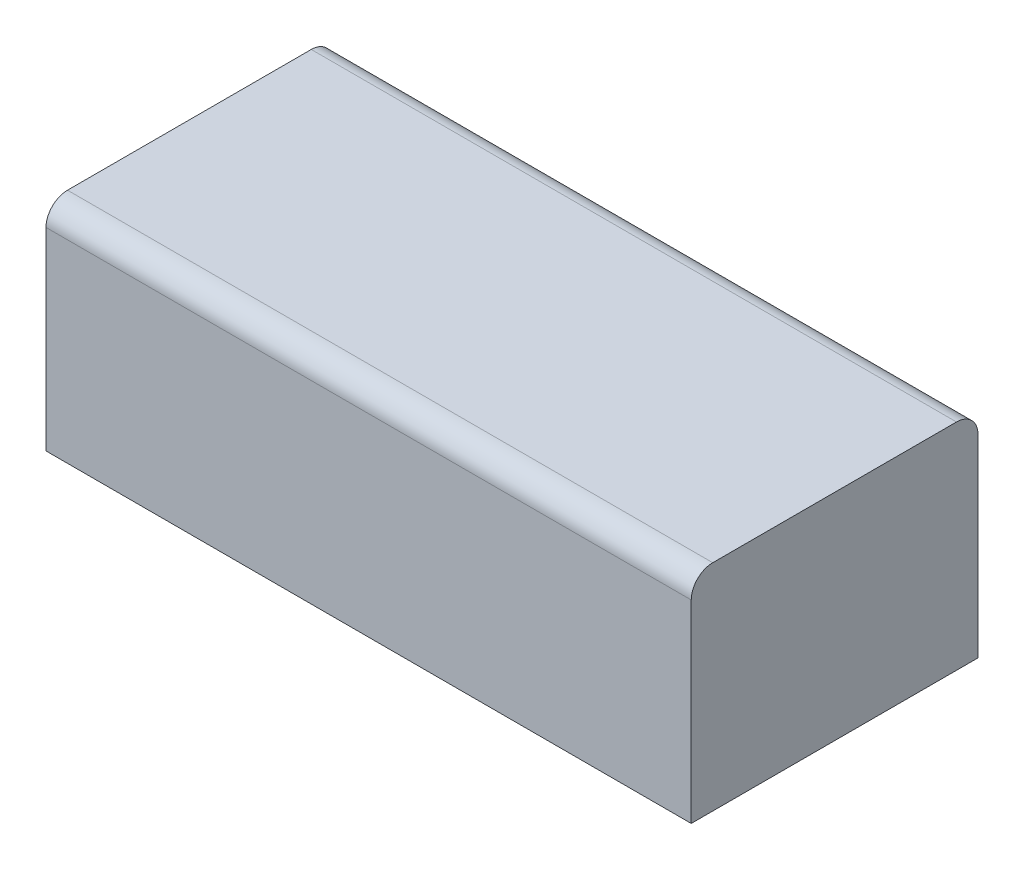
ISO-10303-21;
HEADER;
FILE_DESCRIPTION(('STEP AP214'),'2;1');
FILE_NAME('part.step','',(''),(''),'','','');
FILE_SCHEMA(('AUTOMOTIVE_DESIGN { 1 0 10303 214 1 1 1 1 }'));
ENDSEC;
DATA;
#1=APPLICATION_CONTEXT('core data for automotive mechanical design processes');
#2=APPLICATION_PROTOCOL_DEFINITION('international standard','automotive_design',2000,#1);
#3=PRODUCT_CONTEXT('',#1,'mechanical');
#4=PRODUCT('Part','Part','',(#3));
#5=PRODUCT_RELATED_PRODUCT_CATEGORY('part','',(#4));
#6=PRODUCT_DEFINITION_FORMATION('','',#4);
#7=PRODUCT_DEFINITION_CONTEXT('part definition',#1,'design');
#8=PRODUCT_DEFINITION('design','',#6,#7);
#9=PRODUCT_DEFINITION_SHAPE('','',#8);
#10=(LENGTH_UNIT() NAMED_UNIT(*) SI_UNIT(.MILLI.,.METRE.));
#11=(NAMED_UNIT(*) PLANE_ANGLE_UNIT() SI_UNIT($,.RADIAN.));
#12=(NAMED_UNIT(*) SI_UNIT($,.STERADIAN.) SOLID_ANGLE_UNIT());
#13=UNCERTAINTY_MEASURE_WITH_UNIT(LENGTH_MEASURE(1.E-05),#10,'distance_accuracy_value','');
#14=(GEOMETRIC_REPRESENTATION_CONTEXT(3) GLOBAL_UNCERTAINTY_ASSIGNED_CONTEXT((#13)) GLOBAL_UNIT_ASSIGNED_CONTEXT((#10,
#11,#12)) REPRESENTATION_CONTEXT('',''));
#15=CARTESIAN_POINT('',(0.,0.,0.));
#16=DIRECTION('',(0.,0.,1.));
#17=DIRECTION('',(1.,0.,0.));
#18=AXIS2_PLACEMENT_3D('',#15,#16,#17);
#19=CARTESIAN_POINT('',(0.,30.,0.));
#20=DIRECTION('',(1.,0.,0.));
#21=DIRECTION('',(0.,0.,-1.));
#22=AXIS2_PLACEMENT_3D('',#19,#20,#21);
#23=PLANE('',#22);
#24=DIRECTION('',(0.,0.,1.));
#25=VECTOR('',#24,1.);
#26=CARTESIAN_POINT('',(0.,30.,0.));
#27=LINE('',#26,#25);
#28=CARTESIAN_POINT('',(0.,30.,-37.));
#29=VERTEX_POINT('',#28);
#30=CARTESIAN_POINT('',(0.,30.,-3.));
#31=VERTEX_POINT('',#30);
#32=EDGE_CURVE('E128',#29,#31,#27,.T.);
#33=ORIENTED_EDGE('',*,*,#32,.F.);
#34=CARTESIAN_POINT('',(0.,27.,-37.));
#35=DIRECTION('',(1.,0.,0.));
#36=DIRECTION('',(0.,0.,-1.));
#37=AXIS2_PLACEMENT_3D('',#34,#35,#36);
#38=CIRCLE('',#37,3.);
#39=CARTESIAN_POINT('',(0.,27.,-40.));
#40=VERTEX_POINT('',#39);
#41=EDGE_CURVE('E62',#29,#40,#38,.F.);
#42=ORIENTED_EDGE('',*,*,#41,.T.);
#43=DIRECTION('',(0.,-1.,0.));
#44=VECTOR('',#43,1.);
#45=CARTESIAN_POINT('',(0.,30.,-40.));
#46=LINE('',#45,#44);
#47=CARTESIAN_POINT('',(0.,0.,-40.));
#48=VERTEX_POINT('',#47);
#49=EDGE_CURVE('E115',#40,#48,#46,.T.);
#50=ORIENTED_EDGE('',*,*,#49,.T.);
#51=DIRECTION('',(0.,0.,1.));
#52=VECTOR('',#51,1.);
#53=CARTESIAN_POINT('',(0.,0.,0.));
#54=LINE('',#53,#52);
#55=CARTESIAN_POINT('',(0.,0.,0.));
#56=VERTEX_POINT('',#55);
#57=EDGE_CURVE('E110',#48,#56,#54,.T.);
#58=ORIENTED_EDGE('',*,*,#57,.T.);
#59=DIRECTION('',(0.,-1.,0.));
#60=VECTOR('',#59,1.);
#61=CARTESIAN_POINT('',(0.,30.,0.));
#62=LINE('',#61,#60);
#63=CARTESIAN_POINT('',(0.,27.,0.));
#64=VERTEX_POINT('',#63);
#65=EDGE_CURVE('E91',#64,#56,#62,.T.);
#66=ORIENTED_EDGE('',*,*,#65,.F.);
#67=CARTESIAN_POINT('',(0.,27.,-3.));
#68=DIRECTION('',(1.,0.,0.));
#69=DIRECTION('',(0.,0.,-1.));
#70=AXIS2_PLACEMENT_3D('',#67,#68,#69);
#71=CIRCLE('',#70,3.);
#72=EDGE_CURVE('E144',#64,#31,#71,.F.);
#73=ORIENTED_EDGE('',*,*,#72,.T.);
#74=EDGE_LOOP('',(#33,#42,#50,#58,#66,#73));
#75=FACE_BOUND('',#74,.T.);
#76=ADVANCED_FACE('F39',(#75),#23,.F.);
#77=CARTESIAN_POINT('',(0.,30.,0.));
#78=DIRECTION('',(0.,0.,-1.));
#79=DIRECTION('',(-1.,0.,0.));
#80=AXIS2_PLACEMENT_3D('',#77,#78,#79);
#81=PLANE('',#80);
#82=DIRECTION('',(0.,-1.,0.));
#83=VECTOR('',#82,1.);
#84=CARTESIAN_POINT('',(90.,30.,0.));
#85=LINE('',#84,#83);
#86=CARTESIAN_POINT('',(90.,27.,0.));
#87=VERTEX_POINT('',#86);
#88=CARTESIAN_POINT('',(90.,0.,0.));
#89=VERTEX_POINT('',#88);
#90=EDGE_CURVE('E104',#87,#89,#85,.T.);
#91=ORIENTED_EDGE('',*,*,#90,.F.);
#92=DIRECTION('',(1.,0.,0.));
#93=VECTOR('',#92,1.);
#94=CARTESIAN_POINT('',(0.,27.,0.));
#95=LINE('',#94,#93);
#96=EDGE_CURVE('E98',#87,#64,#95,.F.);
#97=ORIENTED_EDGE('',*,*,#96,.T.);
#98=ORIENTED_EDGE('',*,*,#65,.T.);
#99=DIRECTION('',(1.,0.,0.));
#100=VECTOR('',#99,1.);
#101=CARTESIAN_POINT('',(0.,0.,0.));
#102=LINE('',#101,#100);
#103=EDGE_CURVE('E95',#56,#89,#102,.T.);
#104=ORIENTED_EDGE('',*,*,#103,.T.);
#105=EDGE_LOOP('',(#91,#97,#98,#104));
#106=FACE_BOUND('',#105,.T.);
#107=ADVANCED_FACE('F94',(#106),#81,.F.);
#108=CARTESIAN_POINT('',(90.,30.,0.));
#109=DIRECTION('',(-1.,0.,0.));
#110=DIRECTION('',(0.,0.,1.));
#111=AXIS2_PLACEMENT_3D('',#108,#109,#110);
#112=PLANE('',#111);
#113=DIRECTION('',(0.,-1.,0.));
#114=VECTOR('',#113,1.);
#115=CARTESIAN_POINT('',(90.,30.,-40.));
#116=LINE('',#115,#114);
#117=CARTESIAN_POINT('',(90.,27.,-40.));
#118=VERTEX_POINT('',#117);
#119=CARTESIAN_POINT('',(90.,0.,-40.));
#120=VERTEX_POINT('',#119);
#121=EDGE_CURVE('E131',#118,#120,#116,.T.);
#122=ORIENTED_EDGE('',*,*,#121,.F.);
#123=CARTESIAN_POINT('',(90.,27.,-37.));
#124=DIRECTION('',(-1.,0.,0.));
#125=DIRECTION('',(0.,0.,1.));
#126=AXIS2_PLACEMENT_3D('',#123,#124,#125);
#127=CIRCLE('',#126,3.);
#128=CARTESIAN_POINT('',(90.,30.,-37.));
#129=VERTEX_POINT('',#128);
#130=EDGE_CURVE('E11',#118,#129,#127,.F.);
#131=ORIENTED_EDGE('',*,*,#130,.T.);
#132=DIRECTION('',(0.,0.,-1.));
#133=VECTOR('',#132,1.);
#134=CARTESIAN_POINT('',(90.,30.,0.));
#135=LINE('',#134,#133);
#136=CARTESIAN_POINT('',(90.,30.,-3.));
#137=VERTEX_POINT('',#136);
#138=EDGE_CURVE('E120',#137,#129,#135,.T.);
#139=ORIENTED_EDGE('',*,*,#138,.F.);
#140=CARTESIAN_POINT('',(90.,27.,-3.));
#141=DIRECTION('',(-1.,0.,0.));
#142=DIRECTION('',(0.,0.,1.));
#143=AXIS2_PLACEMENT_3D('',#140,#141,#142);
#144=CIRCLE('',#143,3.);
#145=EDGE_CURVE('E139',#137,#87,#144,.F.);
#146=ORIENTED_EDGE('',*,*,#145,.T.);
#147=ORIENTED_EDGE('',*,*,#90,.T.);
#148=DIRECTION('',(0.,0.,-1.));
#149=VECTOR('',#148,1.);
#150=CARTESIAN_POINT('',(90.,0.,0.));
#151=LINE('',#150,#149);
#152=EDGE_CURVE('E112',#89,#120,#151,.T.);
#153=ORIENTED_EDGE('',*,*,#152,.T.);
#154=EDGE_LOOP('',(#122,#131,#139,#146,#147,#153));
#155=FACE_BOUND('',#154,.T.);
#156=ADVANCED_FACE('F164',(#155),#112,.F.);
#157=CARTESIAN_POINT('',(0.,30.,-40.));
#158=DIRECTION('',(0.,0.,1.));
#159=DIRECTION('',(1.,0.,0.));
#160=AXIS2_PLACEMENT_3D('',#157,#158,#159);
#161=PLANE('',#160);
#162=ORIENTED_EDGE('',*,*,#49,.F.);
#163=DIRECTION('',(-1.,0.,0.));
#164=VECTOR('',#163,1.);
#165=CARTESIAN_POINT('',(0.,27.,-40.));
#166=LINE('',#165,#164);
#167=EDGE_CURVE('E48',#40,#118,#166,.F.);
#168=ORIENTED_EDGE('',*,*,#167,.T.);
#169=ORIENTED_EDGE('',*,*,#121,.T.);
#170=DIRECTION('',(-1.,0.,0.));
#171=VECTOR('',#170,1.);
#172=CARTESIAN_POINT('',(0.,0.,-40.));
#173=LINE('',#172,#171);
#174=EDGE_CURVE('E125',#120,#48,#173,.T.);
#175=ORIENTED_EDGE('',*,*,#174,.T.);
#176=EDGE_LOOP('',(#162,#168,#169,#175));
#177=FACE_BOUND('',#176,.T.);
#178=ADVANCED_FACE('F180',(#177),#161,.F.);
#179=CARTESIAN_POINT('',(0.,30.,0.));
#180=DIRECTION('',(0.,-1.,0.));
#181=DIRECTION('',(0.,0.,-1.));
#182=AXIS2_PLACEMENT_3D('',#179,#180,#181);
#183=PLANE('',#182);
#184=ORIENTED_EDGE('',*,*,#138,.T.);
#185=DIRECTION('',(-1.,0.,0.));
#186=VECTOR('',#185,1.);
#187=CARTESIAN_POINT('',(0.,30.,-37.));
#188=LINE('',#187,#186);
#189=EDGE_CURVE('E147',#129,#29,#188,.T.);
#190=ORIENTED_EDGE('',*,*,#189,.T.);
#191=ORIENTED_EDGE('',*,*,#32,.T.);
#192=DIRECTION('',(1.,0.,0.));
#193=VECTOR('',#192,1.);
#194=CARTESIAN_POINT('',(0.,30.,-3.));
#195=LINE('',#194,#193);
#196=EDGE_CURVE('E103',#31,#137,#195,.T.);
#197=ORIENTED_EDGE('',*,*,#196,.T.);
#198=EDGE_LOOP('',(#184,#190,#191,#197));
#199=FACE_BOUND('',#198,.T.);
#200=ADVANCED_FACE('F157',(#199),#183,.F.);
#201=CARTESIAN_POINT('',(0.,0.,0.));
#202=DIRECTION('',(0.,-1.,0.));
#203=DIRECTION('',(0.,0.,-1.));
#204=AXIS2_PLACEMENT_3D('',#201,#202,#203);
#205=PLANE('',#204);
#206=ORIENTED_EDGE('',*,*,#57,.F.);
#207=ORIENTED_EDGE('',*,*,#174,.F.);
#208=ORIENTED_EDGE('',*,*,#152,.F.);
#209=ORIENTED_EDGE('',*,*,#103,.F.);
#210=EDGE_LOOP('',(#206,#207,#208,#209));
#211=FACE_BOUND('',#210,.T.);
#212=ADVANCED_FACE('F108',(#211),#205,.T.);
#213=CARTESIAN_POINT('',(0.,27.,-3.));
#214=DIRECTION('',(1.,0.,0.));
#215=DIRECTION('',(0.,0.,-1.));
#216=AXIS2_PLACEMENT_3D('',#213,#214,#215);
#217=CYLINDRICAL_SURFACE('',#216,3.);
#218=ORIENTED_EDGE('',*,*,#72,.F.);
#219=ORIENTED_EDGE('',*,*,#96,.F.);
#220=ORIENTED_EDGE('',*,*,#145,.F.);
#221=ORIENTED_EDGE('',*,*,#196,.F.);
#222=EDGE_LOOP('',(#218,#219,#220,#221));
#223=FACE_BOUND('',#222,.T.);
#224=ADVANCED_FACE('F162',(#223),#217,.T.);
#225=CARTESIAN_POINT('',(0.,27.,-37.));
#226=DIRECTION('',(-1.,0.,0.));
#227=DIRECTION('',(0.,0.,1.));
#228=AXIS2_PLACEMENT_3D('',#225,#226,#227);
#229=CYLINDRICAL_SURFACE('',#228,3.);
#230=ORIENTED_EDGE('',*,*,#130,.F.);
#231=ORIENTED_EDGE('',*,*,#167,.F.);
#232=ORIENTED_EDGE('',*,*,#41,.F.);
#233=ORIENTED_EDGE('',*,*,#189,.F.);
#234=EDGE_LOOP('',(#230,#231,#232,#233));
#235=FACE_BOUND('',#234,.T.);
#236=ADVANCED_FACE('F41',(#235),#229,.T.);
#237=CLOSED_SHELL('',(#76,#107,#156,#178,#200,#212,#224,#236));
#238=MANIFOLD_SOLID_BREP('B2',#237);
#239=ADVANCED_BREP_SHAPE_REPRESENTATION('',(#18,#238),#14);
#240=SHAPE_DEFINITION_REPRESENTATION(#9,#239);
ENDSEC;
END-ISO-10303-21;
